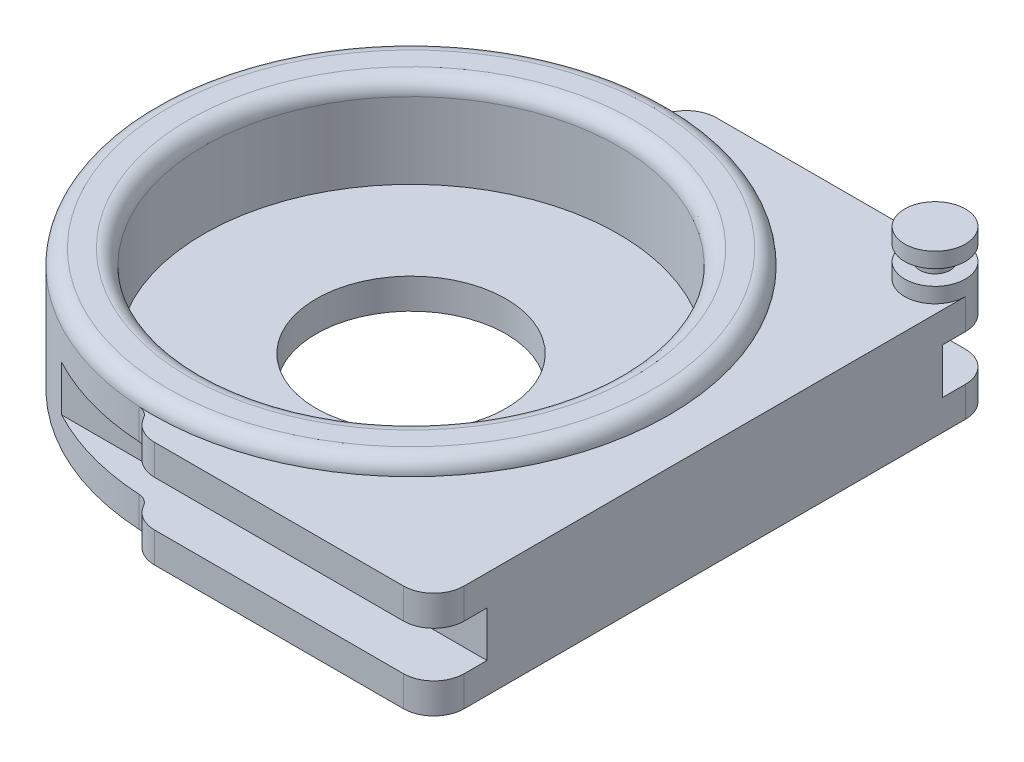
ISO-10303-21;
HEADER;
FILE_DESCRIPTION(('STEP AP214'),'2;1');
FILE_NAME('part.step','',(''),(''),'','','');
FILE_SCHEMA(('AUTOMOTIVE_DESIGN { 1 0 10303 214 1 1 1 1 }'));
ENDSEC;
DATA;
#1=APPLICATION_CONTEXT('core data for automotive mechanical design processes');
#2=APPLICATION_PROTOCOL_DEFINITION('international standard','automotive_design',2000,#1);
#3=PRODUCT_CONTEXT('',#1,'mechanical');
#4=PRODUCT('Part','Part','',(#3));
#5=PRODUCT_RELATED_PRODUCT_CATEGORY('part','',(#4));
#6=PRODUCT_DEFINITION_FORMATION('','',#4);
#7=PRODUCT_DEFINITION_CONTEXT('part definition',#1,'design');
#8=PRODUCT_DEFINITION('design','',#6,#7);
#9=PRODUCT_DEFINITION_SHAPE('','',#8);
#10=(LENGTH_UNIT() NAMED_UNIT(*) SI_UNIT(.MILLI.,.METRE.));
#11=(NAMED_UNIT(*) PLANE_ANGLE_UNIT() SI_UNIT($,.RADIAN.));
#12=(NAMED_UNIT(*) SI_UNIT($,.STERADIAN.) SOLID_ANGLE_UNIT());
#13=UNCERTAINTY_MEASURE_WITH_UNIT(LENGTH_MEASURE(1.E-05),#10,'distance_accuracy_value','');
#14=(GEOMETRIC_REPRESENTATION_CONTEXT(3) GLOBAL_UNCERTAINTY_ASSIGNED_CONTEXT((#13)) GLOBAL_UNIT_ASSIGNED_CONTEXT((#10,
#11,#12)) REPRESENTATION_CONTEXT('',''));
#15=CARTESIAN_POINT('',(0.,0.,0.));
#16=DIRECTION('',(0.,0.,1.));
#17=DIRECTION('',(1.,0.,0.));
#18=AXIS2_PLACEMENT_3D('',#15,#16,#17);
#19=CARTESIAN_POINT('',(-23.6838749144705,8.,0.));
#20=DIRECTION('',(0.,1.,0.));
#21=DIRECTION('',(0.,0.,1.));
#22=AXIS2_PLACEMENT_3D('',#19,#20,#21);
#23=PLANE('',#22);
#24=CARTESIAN_POINT('',(18.,8.,-16.5));
#25=DIRECTION('',(0.,1.,0.));
#26=DIRECTION('',(0.,0.,1.));
#27=AXIS2_PLACEMENT_3D('',#24,#25,#26);
#28=CIRCLE('',#27,2.);
#29=CARTESIAN_POINT('',(18.,8.,-14.5));
#30=VERTEX_POINT('',#29);
#31=EDGE_CURVE('E268',#30,#30,#28,.T.);
#32=ORIENTED_EDGE('',*,*,#31,.T.);
#33=EDGE_LOOP('',(#32));
#34=FACE_BOUND('',#33,.T.);
#35=CARTESIAN_POINT('',(18.,8.,-16.5));
#36=DIRECTION('',(0.,1.,0.));
#37=DIRECTION('',(0.,0.,1.));
#38=AXIS2_PLACEMENT_3D('',#35,#36,#37);
#39=CIRCLE('',#38,1.);
#40=CARTESIAN_POINT('',(18.,8.,-15.5));
#41=VERTEX_POINT('',#40);
#42=EDGE_CURVE('E258',#41,#41,#39,.T.);
#43=ORIENTED_EDGE('',*,*,#42,.F.);
#44=EDGE_LOOP('',(#43));
#45=FACE_BOUND('',#44,.T.);
#46=ADVANCED_FACE('F31',(#34,#45),#23,.T.);
#47=CARTESIAN_POINT('',(-39.3414213562373,7.,0.));
#48=DIRECTION('',(0.,1.,0.));
#49=DIRECTION('',(0.,0.,1.));
#50=AXIS2_PLACEMENT_3D('',#47,#48,#49);
#51=PLANE('',#50);
#52=DIRECTION('',(0.,0.,-1.));
#53=VECTOR('',#52,1.);
#54=CARTESIAN_POINT('',(20.,7.,0.));
#55=LINE('',#54,#53);
#56=CARTESIAN_POINT('',(20.,7.,16.5));
#57=VERTEX_POINT('',#56);
#58=CARTESIAN_POINT('',(20.,7.,-16.5));
#59=VERTEX_POINT('',#58);
#60=EDGE_CURVE('E554',#57,#59,#55,.T.);
#61=ORIENTED_EDGE('',*,*,#60,.T.);
#62=CARTESIAN_POINT('',(18.,7.,-16.5));
#63=DIRECTION('',(0.,1.,0.));
#64=DIRECTION('',(0.,0.,1.));
#65=AXIS2_PLACEMENT_3D('',#62,#63,#64);
#66=CIRCLE('',#65,2.);
#67=CARTESIAN_POINT('',(18.,7.,-18.5));
#68=VERTEX_POINT('',#67);
#69=EDGE_CURVE('E265',#68,#59,#66,.T.);
#70=ORIENTED_EDGE('',*,*,#69,.F.);
#71=DIRECTION('',(-1.,0.,0.));
#72=VECTOR('',#71,1.);
#73=CARTESIAN_POINT('',(-39.3414213562373,7.,-18.5));
#74=LINE('',#73,#72);
#75=CARTESIAN_POINT('',(1.61392902259743,7.,-18.5));
#76=VERTEX_POINT('',#75);
#77=EDGE_CURVE('E310',#68,#76,#74,.T.);
#78=ORIENTED_EDGE('',*,*,#77,.T.);
#79=CARTESIAN_POINT('',(1.61392902259743,7.,-16.5));
#80=DIRECTION('',(0.,1.,0.));
#81=DIRECTION('',(0.,0.,1.));
#82=AXIS2_PLACEMENT_3D('',#79,#80,#81);
#83=CIRCLE('',#82,2.);
#84=CARTESIAN_POINT('',(-0.128690325800858,7.,-17.4814671704076));
#85=VERTEX_POINT('',#84);
#86=EDGE_CURVE('E338',#76,#85,#83,.T.);
#87=ORIENTED_EDGE('',*,*,#86,.T.);
#88=CARTESIAN_POINT('',(-1.,7.,-17.9722007556114));
#89=DIRECTION('',(0.,1.,0.));
#90=DIRECTION('',(0.,0.,1.));
#91=AXIS2_PLACEMENT_3D('',#88,#89,#90);
#92=CIRCLE('',#91,1.);
#93=CARTESIAN_POINT('',(-0.944444444444445,7.,-16.9737451580775));
#94=VERTEX_POINT('',#93);
#95=EDGE_CURVE('E513',#85,#94,#92,.F.);
#96=ORIENTED_EDGE('',*,*,#95,.T.);
#97=CARTESIAN_POINT('',(0.,7.,0.));
#98=DIRECTION('',(0.,1.,0.));
#99=DIRECTION('',(0.,0.,1.));
#100=AXIS2_PLACEMENT_3D('',#97,#98,#99);
#101=CIRCLE('',#100,17.);
#102=CARTESIAN_POINT('',(-0.944444444444445,7.,16.9737451580775));
#103=VERTEX_POINT('',#102);
#104=EDGE_CURVE('E271',#103,#94,#101,.T.);
#105=ORIENTED_EDGE('',*,*,#104,.F.);
#106=CARTESIAN_POINT('',(-1.,7.,17.9722007556114));
#107=DIRECTION('',(0.,1.,0.));
#108=DIRECTION('',(0.,0.,1.));
#109=AXIS2_PLACEMENT_3D('',#106,#107,#108);
#110=CIRCLE('',#109,1.);
#111=CARTESIAN_POINT('',(-0.128690325800858,7.,17.4814671704076));
#112=VERTEX_POINT('',#111);
#113=EDGE_CURVE('E528',#103,#112,#110,.F.);
#114=ORIENTED_EDGE('',*,*,#113,.T.);
#115=CARTESIAN_POINT('',(1.61392902259743,7.,16.5));
#116=DIRECTION('',(0.,1.,0.));
#117=DIRECTION('',(0.,0.,1.));
#118=AXIS2_PLACEMENT_3D('',#115,#116,#117);
#119=CIRCLE('',#118,2.);
#120=CARTESIAN_POINT('',(1.61392902259743,7.,18.5));
#121=VERTEX_POINT('',#120);
#122=EDGE_CURVE('E342',#112,#121,#119,.T.);
#123=ORIENTED_EDGE('',*,*,#122,.T.);
#124=DIRECTION('',(1.,0.,0.));
#125=VECTOR('',#124,1.);
#126=CARTESIAN_POINT('',(-39.3414213562373,7.,18.5));
#127=LINE('',#126,#125);
#128=CARTESIAN_POINT('',(18.,7.,18.5));
#129=VERTEX_POINT('',#128);
#130=EDGE_CURVE('E543',#121,#129,#127,.T.);
#131=ORIENTED_EDGE('',*,*,#130,.T.);
#132=CARTESIAN_POINT('',(18.,7.,16.5));
#133=DIRECTION('',(0.,1.,0.));
#134=DIRECTION('',(0.,0.,1.));
#135=AXIS2_PLACEMENT_3D('',#132,#133,#134);
#136=CIRCLE('',#135,2.);
#137=EDGE_CURVE('E340',#129,#57,#136,.T.);
#138=ORIENTED_EDGE('',*,*,#137,.T.);
#139=EDGE_LOOP('',(#61,#70,#78,#87,#96,#105,#114,#123,#131,#138));
#140=FACE_BOUND('',#139,.T.);
#141=ADVANCED_FACE('F570',(#140),#51,.T.);
#142=CARTESIAN_POINT('',(0.,2.,0.));
#143=DIRECTION('',(0.,-1.,0.));
#144=DIRECTION('',(0.,0.,-1.));
#145=AXIS2_PLACEMENT_3D('',#142,#143,#144);
#146=CYLINDRICAL_SURFACE('',#145,6.25);
#147=CARTESIAN_POINT('',(0.,0.,0.));
#148=DIRECTION('',(0.,1.,0.));
#149=DIRECTION('',(0.,0.,1.));
#150=AXIS2_PLACEMENT_3D('',#147,#148,#149);
#151=CIRCLE('',#150,6.25);
#152=CARTESIAN_POINT('',(0.,0.,6.25));
#153=VERTEX_POINT('',#152);
#154=EDGE_CURVE('E449',#153,#153,#151,.T.);
#155=ORIENTED_EDGE('',*,*,#154,.F.);
#156=EDGE_LOOP('',(#155));
#157=FACE_BOUND('',#156,.T.);
#158=CARTESIAN_POINT('',(0.,2.,0.));
#159=DIRECTION('',(0.,1.,0.));
#160=DIRECTION('',(0.,0.,1.));
#161=AXIS2_PLACEMENT_3D('',#158,#159,#160);
#162=CIRCLE('',#161,6.25);
#163=CARTESIAN_POINT('',(0.,2.,6.25));
#164=VERTEX_POINT('',#163);
#165=EDGE_CURVE('E277',#164,#164,#162,.T.);
#166=ORIENTED_EDGE('',*,*,#165,.T.);
#167=EDGE_LOOP('',(#166));
#168=FACE_BOUND('',#167,.T.);
#169=ADVANCED_FACE('F578',(#157,#168),#146,.F.);
#170=CARTESIAN_POINT('',(-39.3414213562373,2.,0.));
#171=DIRECTION('',(0.,1.,0.));
#172=DIRECTION('',(0.,0.,1.));
#173=AXIS2_PLACEMENT_3D('',#170,#171,#172);
#174=PLANE('',#173);
#175=CARTESIAN_POINT('',(-0.999999999999993,2.,17.9722007556114));
#176=DIRECTION('',(0.,1.,0.));
#177=DIRECTION('',(0.,0.,1.));
#178=AXIS2_PLACEMENT_3D('',#175,#176,#177);
#179=CIRCLE('',#178,1.);
#180=CARTESIAN_POINT('',(-0.944444444444438,2.,16.9737451580775));
#181=VERTEX_POINT('',#180);
#182=CARTESIAN_POINT('',(-0.128690325800851,2.,17.4814671704076));
#183=VERTEX_POINT('',#182);
#184=EDGE_CURVE('E533',#181,#183,#179,.F.);
#185=ORIENTED_EDGE('',*,*,#184,.T.);
#186=CARTESIAN_POINT('',(1.61392902259743,2.,16.5));
#187=DIRECTION('',(0.,1.,0.));
#188=DIRECTION('',(0.,0.,1.));
#189=AXIS2_PLACEMENT_3D('',#186,#187,#188);
#190=CIRCLE('',#189,2.);
#191=CARTESIAN_POINT('',(1.61392902259743,2.,18.5));
#192=VERTEX_POINT('',#191);
#193=EDGE_CURVE('E361',#183,#192,#190,.T.);
#194=ORIENTED_EDGE('',*,*,#193,.T.);
#195=DIRECTION('',(-1.,0.,0.));
#196=VECTOR('',#195,1.);
#197=CARTESIAN_POINT('',(-39.3414213562373,2.,18.5));
#198=LINE('',#197,#196);
#199=CARTESIAN_POINT('',(18.,2.,18.5));
#200=VERTEX_POINT('',#199);
#201=EDGE_CURVE('E372',#200,#192,#198,.T.);
#202=ORIENTED_EDGE('',*,*,#201,.F.);
#203=CARTESIAN_POINT('',(18.,2.,16.5));
#204=DIRECTION('',(0.,1.,0.));
#205=DIRECTION('',(0.,0.,1.));
#206=AXIS2_PLACEMENT_3D('',#203,#204,#205);
#207=CIRCLE('',#206,2.);
#208=CARTESIAN_POINT('',(20.,2.,16.5));
#209=VERTEX_POINT('',#208);
#210=EDGE_CURVE('E359',#200,#209,#207,.T.);
#211=ORIENTED_EDGE('',*,*,#210,.T.);
#212=DIRECTION('',(0.,0.,1.));
#213=VECTOR('',#212,1.);
#214=CARTESIAN_POINT('',(20.,2.,0.));
#215=LINE('',#214,#213);
#216=CARTESIAN_POINT('',(20.,2.,15.));
#217=VERTEX_POINT('',#216);
#218=EDGE_CURVE('E367',#217,#209,#215,.T.);
#219=ORIENTED_EDGE('',*,*,#218,.F.);
#220=DIRECTION('',(1.,0.,0.));
#221=VECTOR('',#220,1.);
#222=CARTESIAN_POINT('',(-39.3414213562373,2.,15.));
#223=LINE('',#222,#221);
#224=CARTESIAN_POINT('',(-8.,2.,15.));
#225=VERTEX_POINT('',#224);
#226=EDGE_CURVE('E385',#225,#217,#223,.T.);
#227=ORIENTED_EDGE('',*,*,#226,.F.);
#228=CARTESIAN_POINT('',(0.,2.,0.));
#229=DIRECTION('',(0.,1.,0.));
#230=DIRECTION('',(0.,0.,1.));
#231=AXIS2_PLACEMENT_3D('',#228,#229,#230);
#232=CIRCLE('',#231,17.);
#233=EDGE_CURVE('E379',#225,#181,#232,.T.);
#234=ORIENTED_EDGE('',*,*,#233,.T.);
#235=EDGE_LOOP('',(#185,#194,#202,#211,#219,#227,#234));
#236=FACE_BOUND('',#235,.T.);
#237=ADVANCED_FACE('F480',(#236),#174,.T.);
#238=CARTESIAN_POINT('',(0.,2.,0.));
#239=DIRECTION('',(0.,-1.,0.));
#240=DIRECTION('',(0.,0.,-1.));
#241=AXIS2_PLACEMENT_3D('',#238,#239,#240);
#242=CYLINDRICAL_SURFACE('',#241,17.);
#243=CARTESIAN_POINT('',(-0.944444444444438,2.,-16.9737451580775));
#244=VERTEX_POINT('',#243);
#245=CARTESIAN_POINT('',(-8.,2.,-15.));
#246=VERTEX_POINT('',#245);
#247=EDGE_CURVE('E304',#244,#246,#232,.T.);
#248=ORIENTED_EDGE('',*,*,#247,.F.);
#249=DIRECTION('',(0.,-1.,0.));
#250=VECTOR('',#249,1.);
#251=CARTESIAN_POINT('',(-0.944444444444438,2.,-16.9737451580775));
#252=LINE('',#251,#250);
#253=CARTESIAN_POINT('',(-0.944444444444438,0.,-16.9737451580775));
#254=VERTEX_POINT('',#253);
#255=EDGE_CURVE('E713',#244,#254,#252,.T.);
#256=ORIENTED_EDGE('',*,*,#255,.T.);
#257=CARTESIAN_POINT('',(0.,0.,0.));
#258=DIRECTION('',(0.,1.,0.));
#259=DIRECTION('',(0.,0.,1.));
#260=AXIS2_PLACEMENT_3D('',#257,#258,#259);
#261=CIRCLE('',#260,17.);
#262=CARTESIAN_POINT('',(-0.944444444444438,0.,16.9737451580775));
#263=VERTEX_POINT('',#262);
#264=EDGE_CURVE('E423',#254,#263,#261,.T.);
#265=ORIENTED_EDGE('',*,*,#264,.T.);
#266=DIRECTION('',(0.,-1.,0.));
#267=VECTOR('',#266,1.);
#268=CARTESIAN_POINT('',(-0.944444444444438,2.,16.9737451580775));
#269=LINE('',#268,#267);
#270=EDGE_CURVE('E716',#263,#181,#269,.F.);
#271=ORIENTED_EDGE('',*,*,#270,.T.);
#272=ORIENTED_EDGE('',*,*,#233,.F.);
#273=DIRECTION('',(0.,-1.,0.));
#274=VECTOR('',#273,1.);
#275=CARTESIAN_POINT('',(-8.,5.,15.));
#276=LINE('',#275,#274);
#277=CARTESIAN_POINT('',(-8.,5.,15.));
#278=VERTEX_POINT('',#277);
#279=EDGE_CURVE('E400',#278,#225,#276,.T.);
#280=ORIENTED_EDGE('',*,*,#279,.F.);
#281=CARTESIAN_POINT('',(0.,5.,0.));
#282=DIRECTION('',(0.,1.,0.));
#283=DIRECTION('',(0.,0.,1.));
#284=AXIS2_PLACEMENT_3D('',#281,#282,#283);
#285=CIRCLE('',#284,17.);
#286=CARTESIAN_POINT('',(-0.944444444444445,5.,16.9737451580775));
#287=VERTEX_POINT('',#286);
#288=EDGE_CURVE('E303',#278,#287,#285,.T.);
#289=ORIENTED_EDGE('',*,*,#288,.T.);
#290=DIRECTION('',(0.,-1.,0.));
#291=VECTOR('',#290,1.);
#292=CARTESIAN_POINT('',(-0.944444444444445,2.,16.9737451580775));
#293=LINE('',#292,#291);
#294=EDGE_CURVE('E712',#287,#103,#293,.F.);
#295=ORIENTED_EDGE('',*,*,#294,.T.);
#296=CARTESIAN_POINT('',(0.,7.,0.));
#297=DIRECTION('',(0.,1.,0.));
#298=DIRECTION('',(0.,0.,1.));
#299=AXIS2_PLACEMENT_3D('',#296,#297,#298);
#300=CIRCLE('',#299,17.);
#301=EDGE_CURVE('E292',#103,#94,#300,.F.);
#302=ORIENTED_EDGE('',*,*,#301,.T.);
#303=DIRECTION('',(0.,-1.,0.));
#304=VECTOR('',#303,1.);
#305=CARTESIAN_POINT('',(-0.944444444444445,2.,-16.9737451580775));
#306=LINE('',#305,#304);
#307=CARTESIAN_POINT('',(-0.944444444444445,5.,-16.9737451580775));
#308=VERTEX_POINT('',#307);
#309=EDGE_CURVE('E710',#94,#308,#306,.T.);
#310=ORIENTED_EDGE('',*,*,#309,.T.);
#311=CARTESIAN_POINT('',(-8.,5.,-15.));
#312=VERTEX_POINT('',#311);
#313=EDGE_CURVE('E299',#308,#312,#285,.T.);
#314=ORIENTED_EDGE('',*,*,#313,.T.);
#315=DIRECTION('',(0.,-1.,0.));
#316=VECTOR('',#315,1.);
#317=CARTESIAN_POINT('',(-8.,5.,-15.));
#318=LINE('',#317,#316);
#319=EDGE_CURVE('E386',#312,#246,#318,.T.);
#320=ORIENTED_EDGE('',*,*,#319,.T.);
#321=EDGE_LOOP('',(#248,#256,#265,#271,#272,#280,#289,#295,#302,#310,#314,#320));
#322=FACE_BOUND('',#321,.T.);
#323=ADVANCED_FACE('F437',(#322),#242,.T.);
#324=CARTESIAN_POINT('',(-39.3414213562373,2.,18.5));
#325=DIRECTION('',(0.,0.,1.));
#326=DIRECTION('',(1.,0.,0.));
#327=AXIS2_PLACEMENT_3D('',#324,#325,#326);
#328=PLANE('',#327);
#329=ORIENTED_EDGE('',*,*,#201,.T.);
#330=DIRECTION('',(0.,1.,0.));
#331=VECTOR('',#330,1.);
#332=CARTESIAN_POINT('',(1.61392902259743,0.,18.5));
#333=LINE('',#332,#331);
#334=CARTESIAN_POINT('',(1.61392902259743,0.,18.5));
#335=VERTEX_POINT('',#334);
#336=EDGE_CURVE('E346',#192,#335,#333,.F.);
#337=ORIENTED_EDGE('',*,*,#336,.T.);
#338=DIRECTION('',(-1.,0.,0.));
#339=VECTOR('',#338,1.);
#340=CARTESIAN_POINT('',(-39.3414213562373,0.,18.5));
#341=LINE('',#340,#339);
#342=CARTESIAN_POINT('',(18.,0.,18.5));
#343=VERTEX_POINT('',#342);
#344=EDGE_CURVE('E426',#343,#335,#341,.T.);
#345=ORIENTED_EDGE('',*,*,#344,.F.);
#346=DIRECTION('',(0.,-1.,0.));
#347=VECTOR('',#346,1.);
#348=CARTESIAN_POINT('',(18.,2.,18.5));
#349=LINE('',#348,#347);
#350=EDGE_CURVE('E344',#343,#200,#349,.F.);
#351=ORIENTED_EDGE('',*,*,#350,.T.);
#352=EDGE_LOOP('',(#329,#337,#345,#351));
#353=FACE_BOUND('',#352,.T.);
#354=ADVANCED_FACE('F471',(#353),#328,.T.);
#355=CARTESIAN_POINT('',(20.,2.,0.));
#356=DIRECTION('',(1.,0.,0.));
#357=DIRECTION('',(0.,0.,-1.));
#358=AXIS2_PLACEMENT_3D('',#355,#356,#357);
#359=PLANE('',#358);
#360=ORIENTED_EDGE('',*,*,#218,.T.);
#361=DIRECTION('',(0.,-1.,0.));
#362=VECTOR('',#361,1.);
#363=CARTESIAN_POINT('',(20.,2.,16.5));
#364=LINE('',#363,#362);
#365=CARTESIAN_POINT('',(20.,0.,16.5));
#366=VERTEX_POINT('',#365);
#367=EDGE_CURVE('E479',#209,#366,#364,.T.);
#368=ORIENTED_EDGE('',*,*,#367,.T.);
#369=DIRECTION('',(0.,0.,1.));
#370=VECTOR('',#369,1.);
#371=CARTESIAN_POINT('',(20.,0.,0.));
#372=LINE('',#371,#370);
#373=CARTESIAN_POINT('',(20.,0.,-16.5));
#374=VERTEX_POINT('',#373);
#375=EDGE_CURVE('E459',#374,#366,#372,.T.);
#376=ORIENTED_EDGE('',*,*,#375,.F.);
#377=DIRECTION('',(0.,-1.,0.));
#378=VECTOR('',#377,1.);
#379=CARTESIAN_POINT('',(20.,2.,-16.5));
#380=LINE('',#379,#378);
#381=CARTESIAN_POINT('',(20.,2.,-16.5));
#382=VERTEX_POINT('',#381);
#383=EDGE_CURVE('E363',#374,#382,#380,.F.);
#384=ORIENTED_EDGE('',*,*,#383,.T.);
#385=CARTESIAN_POINT('',(20.,2.,-15.));
#386=VERTEX_POINT('',#385);
#387=EDGE_CURVE('E364',#382,#386,#215,.T.);
#388=ORIENTED_EDGE('',*,*,#387,.T.);
#389=DIRECTION('',(0.,-1.,0.));
#390=VECTOR('',#389,1.);
#391=CARTESIAN_POINT('',(20.,5.,-15.));
#392=LINE('',#391,#390);
#393=CARTESIAN_POINT('',(20.,5.,-15.));
#394=VERTEX_POINT('',#393);
#395=EDGE_CURVE('E424',#394,#386,#392,.T.);
#396=ORIENTED_EDGE('',*,*,#395,.F.);
#397=DIRECTION('',(0.,0.,-1.));
#398=VECTOR('',#397,1.);
#399=CARTESIAN_POINT('',(20.,5.,0.));
#400=LINE('',#399,#398);
#401=CARTESIAN_POINT('',(20.,5.,-16.5));
#402=VERTEX_POINT('',#401);
#403=EDGE_CURVE('E320',#394,#402,#400,.T.);
#404=ORIENTED_EDGE('',*,*,#403,.T.);
#405=DIRECTION('',(0.,-1.,0.));
#406=VECTOR('',#405,1.);
#407=CARTESIAN_POINT('',(20.,7.,-16.5));
#408=LINE('',#407,#406);
#409=EDGE_CURVE('E555',#402,#59,#408,.F.);
#410=ORIENTED_EDGE('',*,*,#409,.T.);
#411=ORIENTED_EDGE('',*,*,#60,.F.);
#412=DIRECTION('',(0.,-1.,0.));
#413=VECTOR('',#412,1.);
#414=CARTESIAN_POINT('',(20.,5.,16.5));
#415=LINE('',#414,#413);
#416=CARTESIAN_POINT('',(20.,5.,16.5));
#417=VERTEX_POINT('',#416);
#418=EDGE_CURVE('E485',#57,#417,#415,.T.);
#419=ORIENTED_EDGE('',*,*,#418,.T.);
#420=CARTESIAN_POINT('',(20.,5.,15.));
#421=VERTEX_POINT('',#420);
#422=EDGE_CURVE('E322',#417,#421,#400,.T.);
#423=ORIENTED_EDGE('',*,*,#422,.T.);
#424=DIRECTION('',(0.,-1.,0.));
#425=VECTOR('',#424,1.);
#426=CARTESIAN_POINT('',(20.,5.,15.));
#427=LINE('',#426,#425);
#428=EDGE_CURVE('E421',#421,#217,#427,.T.);
#429=ORIENTED_EDGE('',*,*,#428,.T.);
#430=EDGE_LOOP('',(#360,#368,#376,#384,#388,#396,#404,#410,#411,#419,#423,#429));
#431=FACE_BOUND('',#430,.T.);
#432=ADVANCED_FACE('F481',(#431),#359,.T.);
#433=CARTESIAN_POINT('',(-39.3414213562373,2.,-18.5));
#434=DIRECTION('',(0.,0.,1.));
#435=DIRECTION('',(1.,0.,0.));
#436=AXIS2_PLACEMENT_3D('',#433,#434,#435);
#437=PLANE('',#436);
#438=DIRECTION('',(-1.,0.,0.));
#439=VECTOR('',#438,1.);
#440=CARTESIAN_POINT('',(-39.3414213562373,2.,-18.5));
#441=LINE('',#440,#439);
#442=CARTESIAN_POINT('',(18.,2.,-18.5));
#443=VERTEX_POINT('',#442);
#444=CARTESIAN_POINT('',(1.61392902259743,2.,-18.5));
#445=VERTEX_POINT('',#444);
#446=EDGE_CURVE('E289',#443,#445,#441,.T.);
#447=ORIENTED_EDGE('',*,*,#446,.F.);
#448=DIRECTION('',(0.,-1.,0.));
#449=VECTOR('',#448,1.);
#450=CARTESIAN_POINT('',(18.,0.,-18.5));
#451=LINE('',#450,#449);
#452=CARTESIAN_POINT('',(18.,0.,-18.5));
#453=VERTEX_POINT('',#452);
#454=EDGE_CURVE('E492',#443,#453,#451,.T.);
#455=ORIENTED_EDGE('',*,*,#454,.T.);
#456=DIRECTION('',(-1.,0.,0.));
#457=VECTOR('',#456,1.);
#458=CARTESIAN_POINT('',(-39.3414213562373,0.,-18.5));
#459=LINE('',#458,#457);
#460=CARTESIAN_POINT('',(1.61392902259743,0.,-18.5));
#461=VERTEX_POINT('',#460);
#462=EDGE_CURVE('E455',#453,#461,#459,.T.);
#463=ORIENTED_EDGE('',*,*,#462,.T.);
#464=DIRECTION('',(0.,-1.,0.));
#465=VECTOR('',#464,1.);
#466=CARTESIAN_POINT('',(1.61392902259743,2.,-18.5));
#467=LINE('',#466,#465);
#468=EDGE_CURVE('E497',#461,#445,#467,.F.);
#469=ORIENTED_EDGE('',*,*,#468,.T.);
#470=EDGE_LOOP('',(#447,#455,#463,#469));
#471=FACE_BOUND('',#470,.T.);
#472=ADVANCED_FACE('F495',(#471),#437,.F.);
#473=ORIENTED_EDGE('',*,*,#387,.F.);
#474=CARTESIAN_POINT('',(18.,2.,-16.5));
#475=DIRECTION('',(0.,1.,0.));
#476=DIRECTION('',(0.,0.,1.));
#477=AXIS2_PLACEMENT_3D('',#474,#475,#476);
#478=CIRCLE('',#477,2.);
#479=EDGE_CURVE('E499',#382,#443,#478,.T.);
#480=ORIENTED_EDGE('',*,*,#479,.T.);
#481=ORIENTED_EDGE('',*,*,#446,.T.);
#482=CARTESIAN_POINT('',(1.61392902259743,2.,-16.5));
#483=DIRECTION('',(0.,1.,0.));
#484=DIRECTION('',(0.,0.,1.));
#485=AXIS2_PLACEMENT_3D('',#482,#483,#484);
#486=CIRCLE('',#485,2.);
#487=CARTESIAN_POINT('',(-0.128690325800851,2.,-17.4814671704076));
#488=VERTEX_POINT('',#487);
#489=EDGE_CURVE('E54',#445,#488,#486,.T.);
#490=ORIENTED_EDGE('',*,*,#489,.T.);
#491=CARTESIAN_POINT('',(-0.999999999999993,2.,-17.9722007556114));
#492=DIRECTION('',(0.,1.,0.));
#493=DIRECTION('',(0.,0.,1.));
#494=AXIS2_PLACEMENT_3D('',#491,#492,#493);
#495=CIRCLE('',#494,1.);
#496=EDGE_CURVE('E446',#488,#244,#495,.F.);
#497=ORIENTED_EDGE('',*,*,#496,.T.);
#498=ORIENTED_EDGE('',*,*,#247,.T.);
#499=DIRECTION('',(-1.,0.,0.));
#500=VECTOR('',#499,1.);
#501=CARTESIAN_POINT('',(-39.3414213562373,2.,-15.));
#502=LINE('',#501,#500);
#503=EDGE_CURVE('E381',#386,#246,#502,.T.);
#504=ORIENTED_EDGE('',*,*,#503,.F.);
#505=EDGE_LOOP('',(#473,#480,#481,#490,#497,#498,#504));
#506=FACE_BOUND('',#505,.T.);
#507=ADVANCED_FACE('F444',(#506),#174,.T.);
#508=CARTESIAN_POINT('',(-39.3414213562373,0.,0.));
#509=DIRECTION('',(0.,1.,0.));
#510=DIRECTION('',(0.,0.,1.));
#511=AXIS2_PLACEMENT_3D('',#508,#509,#510);
#512=PLANE('',#511);
#513=DIRECTION('',(0.,0.,1.));
#514=VECTOR('',#513,1.);
#515=CARTESIAN_POINT('',(19.,0.,-40.8414213562373));
#516=LINE('',#515,#514);
#517=CARTESIAN_POINT('',(19.,0.,-14.));
#518=VERTEX_POINT('',#517);
#519=CARTESIAN_POINT('',(19.,0.,14.));
#520=VERTEX_POINT('',#519);
#521=EDGE_CURVE('E241',#518,#520,#516,.T.);
#522=ORIENTED_EDGE('',*,*,#521,.F.);
#523=DIRECTION('',(1.,0.,0.));
#524=VECTOR('',#523,1.);
#525=CARTESIAN_POINT('',(1.5,0.,-14.));
#526=LINE('',#525,#524);
#527=CARTESIAN_POINT('',(9.64365076099295,0.,-14.));
#528=VERTEX_POINT('',#527);
#529=EDGE_CURVE('E234',#528,#518,#526,.T.);
#530=ORIENTED_EDGE('',*,*,#529,.F.);
#531=CARTESIAN_POINT('',(0.,0.,0.));
#532=DIRECTION('',(0.,-1.,0.));
#533=DIRECTION('',(0.,0.,-1.));
#534=AXIS2_PLACEMENT_3D('',#531,#532,#533);
#535=CIRCLE('',#534,17.);
#536=CARTESIAN_POINT('',(9.64365076099297,0.,14.));
#537=VERTEX_POINT('',#536);
#538=EDGE_CURVE('E245',#528,#537,#535,.T.);
#539=ORIENTED_EDGE('',*,*,#538,.T.);
#540=DIRECTION('',(-1.,0.,0.));
#541=VECTOR('',#540,1.);
#542=CARTESIAN_POINT('',(1.5,0.,14.));
#543=LINE('',#542,#541);
#544=EDGE_CURVE('E46',#520,#537,#543,.T.);
#545=ORIENTED_EDGE('',*,*,#544,.F.);
#546=EDGE_LOOP('',(#522,#530,#539,#545));
#547=FACE_BOUND('',#546,.T.);
#548=ORIENTED_EDGE('',*,*,#344,.T.);
#549=CARTESIAN_POINT('',(1.61392902259743,0.,16.5));
#550=DIRECTION('',(0.,1.,0.));
#551=DIRECTION('',(0.,0.,1.));
#552=AXIS2_PLACEMENT_3D('',#549,#550,#551);
#553=CIRCLE('',#552,2.);
#554=CARTESIAN_POINT('',(-0.128690325800851,0.,17.4814671704076));
#555=VERTEX_POINT('',#554);
#556=EDGE_CURVE('E355',#335,#555,#553,.F.);
#557=ORIENTED_EDGE('',*,*,#556,.T.);
#558=CARTESIAN_POINT('',(-0.999999999999993,0.,17.9722007556114));
#559=DIRECTION('',(0.,1.,0.));
#560=DIRECTION('',(0.,0.,1.));
#561=AXIS2_PLACEMENT_3D('',#558,#559,#560);
#562=CIRCLE('',#561,1.);
#563=EDGE_CURVE('E531',#555,#263,#562,.T.);
#564=ORIENTED_EDGE('',*,*,#563,.T.);
#565=ORIENTED_EDGE('',*,*,#264,.F.);
#566=CARTESIAN_POINT('',(-0.999999999999993,0.,-17.9722007556114));
#567=DIRECTION('',(0.,1.,0.));
#568=DIRECTION('',(0.,0.,1.));
#569=AXIS2_PLACEMENT_3D('',#566,#567,#568);
#570=CIRCLE('',#569,1.);
#571=CARTESIAN_POINT('',(-0.128690325800851,0.,-17.4814671704076));
#572=VERTEX_POINT('',#571);
#573=EDGE_CURVE('E523',#254,#572,#570,.T.);
#574=ORIENTED_EDGE('',*,*,#573,.T.);
#575=CARTESIAN_POINT('',(1.61392902259743,0.,-16.5));
#576=DIRECTION('',(0.,1.,0.));
#577=DIRECTION('',(0.,0.,1.));
#578=AXIS2_PLACEMENT_3D('',#575,#576,#577);
#579=CIRCLE('',#578,2.);
#580=EDGE_CURVE('E349',#572,#461,#579,.F.);
#581=ORIENTED_EDGE('',*,*,#580,.T.);
#582=ORIENTED_EDGE('',*,*,#462,.F.);
#583=CARTESIAN_POINT('',(18.,0.,-16.5));
#584=DIRECTION('',(0.,1.,0.));
#585=DIRECTION('',(0.,0.,1.));
#586=AXIS2_PLACEMENT_3D('',#583,#584,#585);
#587=CIRCLE('',#586,2.);
#588=EDGE_CURVE('E351',#453,#374,#587,.F.);
#589=ORIENTED_EDGE('',*,*,#588,.T.);
#590=ORIENTED_EDGE('',*,*,#375,.T.);
#591=CARTESIAN_POINT('',(18.,0.,16.5));
#592=DIRECTION('',(0.,1.,0.));
#593=DIRECTION('',(0.,0.,1.));
#594=AXIS2_PLACEMENT_3D('',#591,#592,#593);
#595=CIRCLE('',#594,2.);
#596=EDGE_CURVE('E353',#366,#343,#595,.F.);
#597=ORIENTED_EDGE('',*,*,#596,.T.);
#598=EDGE_LOOP('',(#548,#557,#564,#565,#574,#581,#582,#589,#590,#597));
#599=FACE_BOUND('',#598,.T.);
#600=ORIENTED_EDGE('',*,*,#154,.T.);
#601=EDGE_LOOP('',(#600));
#602=FACE_BOUND('',#601,.T.);
#603=ADVANCED_FACE('F467',(#547,#599,#602),#512,.F.);
#604=CARTESIAN_POINT('',(-39.3414213562373,5.,15.));
#605=DIRECTION('',(0.,0.,-1.));
#606=DIRECTION('',(-1.,0.,0.));
#607=AXIS2_PLACEMENT_3D('',#604,#605,#606);
#608=PLANE('',#607);
#609=ORIENTED_EDGE('',*,*,#226,.T.);
#610=ORIENTED_EDGE('',*,*,#428,.F.);
#611=DIRECTION('',(1.,0.,0.));
#612=VECTOR('',#611,1.);
#613=CARTESIAN_POINT('',(-39.3414213562373,5.,15.));
#614=LINE('',#613,#612);
#615=EDGE_CURVE('E282',#278,#421,#614,.T.);
#616=ORIENTED_EDGE('',*,*,#615,.F.);
#617=ORIENTED_EDGE('',*,*,#279,.T.);
#618=EDGE_LOOP('',(#609,#610,#616,#617));
#619=FACE_BOUND('',#618,.T.);
#620=ADVANCED_FACE('F419',(#619),#608,.F.);
#621=CARTESIAN_POINT('',(-39.3414213562373,5.,-15.));
#622=DIRECTION('',(0.,0.,1.));
#623=DIRECTION('',(1.,0.,0.));
#624=AXIS2_PLACEMENT_3D('',#621,#622,#623);
#625=PLANE('',#624);
#626=ORIENTED_EDGE('',*,*,#503,.T.);
#627=ORIENTED_EDGE('',*,*,#319,.F.);
#628=DIRECTION('',(-1.,0.,0.));
#629=VECTOR('',#628,1.);
#630=CARTESIAN_POINT('',(-39.3414213562373,5.,-15.));
#631=LINE('',#630,#629);
#632=EDGE_CURVE('E403',#394,#312,#631,.T.);
#633=ORIENTED_EDGE('',*,*,#632,.F.);
#634=ORIENTED_EDGE('',*,*,#395,.T.);
#635=EDGE_LOOP('',(#626,#627,#633,#634));
#636=FACE_BOUND('',#635,.T.);
#637=ADVANCED_FACE('F441',(#636),#625,.F.);
#638=CARTESIAN_POINT('',(-39.3414213562373,5.,0.));
#639=DIRECTION('',(0.,1.,0.));
#640=DIRECTION('',(0.,0.,1.));
#641=AXIS2_PLACEMENT_3D('',#638,#639,#640);
#642=PLANE('',#641);
#643=DIRECTION('',(1.,0.,0.));
#644=VECTOR('',#643,1.);
#645=CARTESIAN_POINT('',(-39.3414213562373,5.,18.5));
#646=LINE('',#645,#644);
#647=CARTESIAN_POINT('',(1.61392902259743,5.,18.5));
#648=VERTEX_POINT('',#647);
#649=CARTESIAN_POINT('',(18.,5.,18.5));
#650=VERTEX_POINT('',#649);
#651=EDGE_CURVE('E302',#648,#650,#646,.T.);
#652=ORIENTED_EDGE('',*,*,#651,.F.);
#653=CARTESIAN_POINT('',(1.61392902259743,5.,16.5));
#654=DIRECTION('',(0.,1.,0.));
#655=DIRECTION('',(0.,0.,1.));
#656=AXIS2_PLACEMENT_3D('',#653,#654,#655);
#657=CIRCLE('',#656,2.);
#658=CARTESIAN_POINT('',(-0.128690325800858,5.,17.4814671704076));
#659=VERTEX_POINT('',#658);
#660=EDGE_CURVE('E334',#648,#659,#657,.F.);
#661=ORIENTED_EDGE('',*,*,#660,.T.);
#662=CARTESIAN_POINT('',(-1.,5.,17.9722007556114));
#663=DIRECTION('',(0.,1.,0.));
#664=DIRECTION('',(0.,0.,1.));
#665=AXIS2_PLACEMENT_3D('',#662,#663,#664);
#666=CIRCLE('',#665,1.);
#667=EDGE_CURVE('E521',#659,#287,#666,.T.);
#668=ORIENTED_EDGE('',*,*,#667,.T.);
#669=ORIENTED_EDGE('',*,*,#288,.F.);
#670=ORIENTED_EDGE('',*,*,#615,.T.);
#671=ORIENTED_EDGE('',*,*,#422,.F.);
#672=CARTESIAN_POINT('',(18.,5.,16.5));
#673=DIRECTION('',(0.,1.,0.));
#674=DIRECTION('',(0.,0.,1.));
#675=AXIS2_PLACEMENT_3D('',#672,#673,#674);
#676=CIRCLE('',#675,2.);
#677=EDGE_CURVE('E332',#417,#650,#676,.F.);
#678=ORIENTED_EDGE('',*,*,#677,.T.);
#679=EDGE_LOOP('',(#652,#661,#668,#669,#670,#671,#678));
#680=FACE_BOUND('',#679,.T.);
#681=ADVANCED_FACE('F416',(#680),#642,.F.);
#682=DIRECTION('',(-1.,0.,0.));
#683=VECTOR('',#682,1.);
#684=CARTESIAN_POINT('',(-39.3414213562373,5.,-18.5));
#685=LINE('',#684,#683);
#686=CARTESIAN_POINT('',(18.,5.,-18.5));
#687=VERTEX_POINT('',#686);
#688=CARTESIAN_POINT('',(1.61392902259743,5.,-18.5));
#689=VERTEX_POINT('',#688);
#690=EDGE_CURVE('E319',#687,#689,#685,.T.);
#691=ORIENTED_EDGE('',*,*,#690,.F.);
#692=CARTESIAN_POINT('',(18.,5.,-16.5));
#693=DIRECTION('',(0.,1.,0.));
#694=DIRECTION('',(0.,0.,1.));
#695=AXIS2_PLACEMENT_3D('',#692,#693,#694);
#696=CIRCLE('',#695,2.);
#697=EDGE_CURVE('E501',#687,#402,#696,.F.);
#698=ORIENTED_EDGE('',*,*,#697,.T.);
#699=ORIENTED_EDGE('',*,*,#403,.F.);
#700=ORIENTED_EDGE('',*,*,#632,.T.);
#701=ORIENTED_EDGE('',*,*,#313,.F.);
#702=CARTESIAN_POINT('',(-1.,5.,-17.9722007556114));
#703=DIRECTION('',(0.,1.,0.));
#704=DIRECTION('',(0.,0.,1.));
#705=AXIS2_PLACEMENT_3D('',#702,#703,#704);
#706=CIRCLE('',#705,1.);
#707=CARTESIAN_POINT('',(-0.128690325800858,5.,-17.4814671704076));
#708=VERTEX_POINT('',#707);
#709=EDGE_CURVE('E512',#308,#708,#706,.T.);
#710=ORIENTED_EDGE('',*,*,#709,.T.);
#711=CARTESIAN_POINT('',(1.61392902259743,5.,-16.5));
#712=DIRECTION('',(0.,1.,0.));
#713=DIRECTION('',(0.,0.,1.));
#714=AXIS2_PLACEMENT_3D('',#711,#712,#713);
#715=CIRCLE('',#714,2.);
#716=EDGE_CURVE('E518',#708,#689,#715,.F.);
#717=ORIENTED_EDGE('',*,*,#716,.T.);
#718=EDGE_LOOP('',(#691,#698,#699,#700,#701,#710,#717));
#719=FACE_BOUND('',#718,.T.);
#720=ADVANCED_FACE('F517',(#719),#642,.F.);
#721=CARTESIAN_POINT('',(-39.3414213562373,7.,18.5));
#722=DIRECTION('',(0.,0.,-1.));
#723=DIRECTION('',(-1.,0.,0.));
#724=AXIS2_PLACEMENT_3D('',#721,#722,#723);
#725=PLANE('',#724);
#726=ORIENTED_EDGE('',*,*,#130,.F.);
#727=DIRECTION('',(0.,-1.,0.));
#728=VECTOR('',#727,1.);
#729=CARTESIAN_POINT('',(1.61392902259743,7.,18.5));
#730=LINE('',#729,#728);
#731=EDGE_CURVE('E330',#121,#648,#730,.T.);
#732=ORIENTED_EDGE('',*,*,#731,.T.);
#733=ORIENTED_EDGE('',*,*,#651,.T.);
#734=DIRECTION('',(0.,-1.,0.));
#735=VECTOR('',#734,1.);
#736=CARTESIAN_POINT('',(18.,7.,18.5));
#737=LINE('',#736,#735);
#738=EDGE_CURVE('E534',#650,#129,#737,.F.);
#739=ORIENTED_EDGE('',*,*,#738,.T.);
#740=EDGE_LOOP('',(#726,#732,#733,#739));
#741=FACE_BOUND('',#740,.T.);
#742=ADVANCED_FACE('F542',(#741),#725,.F.);
#743=CARTESIAN_POINT('',(-39.3414213562373,7.,-18.5));
#744=DIRECTION('',(0.,0.,1.));
#745=DIRECTION('',(1.,0.,0.));
#746=AXIS2_PLACEMENT_3D('',#743,#744,#745);
#747=PLANE('',#746);
#748=ORIENTED_EDGE('',*,*,#77,.F.);
#749=DIRECTION('',(0.,-1.,0.));
#750=VECTOR('',#749,1.);
#751=CARTESIAN_POINT('',(18.,5.,-18.5));
#752=LINE('',#751,#750);
#753=EDGE_CURVE('E559',#68,#687,#752,.T.);
#754=ORIENTED_EDGE('',*,*,#753,.T.);
#755=ORIENTED_EDGE('',*,*,#690,.T.);
#756=DIRECTION('',(0.,-1.,0.));
#757=VECTOR('',#756,1.);
#758=CARTESIAN_POINT('',(1.61392902259743,7.,-18.5));
#759=LINE('',#758,#757);
#760=EDGE_CURVE('E484',#689,#76,#759,.F.);
#761=ORIENTED_EDGE('',*,*,#760,.T.);
#762=EDGE_LOOP('',(#748,#754,#755,#761));
#763=FACE_BOUND('',#762,.T.);
#764=ADVANCED_FACE('F595',(#763),#747,.F.);
#765=CARTESIAN_POINT('',(0.,-36.6080302527855,0.));
#766=DIRECTION('',(0.,1.,0.));
#767=DIRECTION('',(0.,0.,1.));
#768=AXIS2_PLACEMENT_3D('',#765,#766,#767);
#769=CYLINDRICAL_SURFACE('',#768,13.65);
#770=CARTESIAN_POINT('',(0.,7.,0.));
#771=DIRECTION('',(0.,1.,0.));
#772=DIRECTION('',(0.,0.,1.));
#773=AXIS2_PLACEMENT_3D('',#770,#771,#772);
#774=CIRCLE('',#773,13.65);
#775=CARTESIAN_POINT('',(0.,7.,13.65));
#776=VERTEX_POINT('',#775);
#777=EDGE_CURVE('E295',#776,#776,#774,.T.);
#778=ORIENTED_EDGE('',*,*,#777,.T.);
#779=EDGE_LOOP('',(#778));
#780=FACE_BOUND('',#779,.T.);
#781=CARTESIAN_POINT('',(0.,2.,0.));
#782=DIRECTION('',(0.,1.,0.));
#783=DIRECTION('',(0.,0.,1.));
#784=AXIS2_PLACEMENT_3D('',#781,#782,#783);
#785=CIRCLE('',#784,13.65);
#786=CARTESIAN_POINT('',(0.,2.,13.65));
#787=VERTEX_POINT('',#786);
#788=EDGE_CURVE('E318',#787,#787,#785,.F.);
#789=ORIENTED_EDGE('',*,*,#788,.T.);
#790=EDGE_LOOP('',(#789));
#791=FACE_BOUND('',#790,.T.);
#792=ADVANCED_FACE('F584',(#780,#791),#769,.F.);
#793=CARTESIAN_POINT('',(-39.3414213562373,2.,0.));
#794=DIRECTION('',(0.,1.,0.));
#795=DIRECTION('',(0.,0.,1.));
#796=AXIS2_PLACEMENT_3D('',#793,#794,#795);
#797=PLANE('',#796);
#798=ORIENTED_EDGE('',*,*,#165,.F.);
#799=EDGE_LOOP('',(#798));
#800=FACE_BOUND('',#799,.T.);
#801=ORIENTED_EDGE('',*,*,#788,.F.);
#802=EDGE_LOOP('',(#801));
#803=FACE_BOUND('',#802,.T.);
#804=ADVANCED_FACE('F580',(#800,#803),#797,.T.);
#805=CARTESIAN_POINT('',(-39.3414213562373,8.,0.));
#806=DIRECTION('',(0.,1.,0.));
#807=DIRECTION('',(0.,0.,1.));
#808=AXIS2_PLACEMENT_3D('',#805,#806,#807);
#809=PLANE('',#808);
#810=CARTESIAN_POINT('',(0.,8.,0.));
#811=DIRECTION('',(0.,1.,0.));
#812=DIRECTION('',(0.,0.,1.));
#813=AXIS2_PLACEMENT_3D('',#810,#811,#812);
#814=CIRCLE('',#813,16.);
#815=CARTESIAN_POINT('',(0.,8.,16.));
#816=VERTEX_POINT('',#815);
#817=EDGE_CURVE('E288',#816,#816,#814,.T.);
#818=ORIENTED_EDGE('',*,*,#817,.T.);
#819=EDGE_LOOP('',(#818));
#820=FACE_BOUND('',#819,.T.);
#821=CARTESIAN_POINT('',(0.,8.,0.));
#822=DIRECTION('',(0.,1.,0.));
#823=DIRECTION('',(0.,0.,1.));
#824=AXIS2_PLACEMENT_3D('',#821,#822,#823);
#825=CIRCLE('',#824,14.65);
#826=CARTESIAN_POINT('',(0.,8.,14.65));
#827=VERTEX_POINT('',#826);
#828=EDGE_CURVE('E285',#827,#827,#825,.F.);
#829=ORIENTED_EDGE('',*,*,#828,.T.);
#830=EDGE_LOOP('',(#829));
#831=FACE_BOUND('',#830,.T.);
#832=ADVANCED_FACE('F583',(#820,#831),#809,.T.);
#833=CARTESIAN_POINT('',(0.,7.,0.));
#834=DIRECTION('',(0.,1.,0.));
#835=DIRECTION('',(0.,0.,1.));
#836=AXIS2_PLACEMENT_3D('',#833,#834,#835);
#837=TOROIDAL_SURFACE('',#836,16.,1.);
#838=ORIENTED_EDGE('',*,*,#104,.T.);
#839=ORIENTED_EDGE('',*,*,#301,.F.);
#840=EDGE_LOOP('',(#838,#839));
#841=FACE_BOUND('',#840,.T.);
#842=ORIENTED_EDGE('',*,*,#817,.F.);
#843=EDGE_LOOP('',(#842));
#844=FACE_BOUND('',#843,.T.);
#845=ADVANCED_FACE('F591',(#841,#844),#837,.T.);
#846=CARTESIAN_POINT('',(0.,7.,0.));
#847=DIRECTION('',(0.,1.,0.));
#848=DIRECTION('',(0.,0.,1.));
#849=AXIS2_PLACEMENT_3D('',#846,#847,#848);
#850=TOROIDAL_SURFACE('',#849,14.65,1.);
#851=ORIENTED_EDGE('',*,*,#828,.F.);
#852=EDGE_LOOP('',(#851));
#853=FACE_BOUND('',#852,.T.);
#854=ORIENTED_EDGE('',*,*,#777,.F.);
#855=EDGE_LOOP('',(#854));
#856=FACE_BOUND('',#855,.T.);
#857=ADVANCED_FACE('F667',(#853,#856),#850,.T.);
#858=CARTESIAN_POINT('',(-0.999999999999993,2.,-17.9722007556114));
#859=DIRECTION('',(0.,-1.,0.));
#860=DIRECTION('',(0.,0.,-1.));
#861=AXIS2_PLACEMENT_3D('',#858,#859,#860);
#862=CYLINDRICAL_SURFACE('',#861,1.);
#863=ORIENTED_EDGE('',*,*,#496,.F.);
#864=DIRECTION('',(0.,-1.,0.));
#865=VECTOR('',#864,1.);
#866=CARTESIAN_POINT('',(-0.128690325800851,2.,-17.4814671704076));
#867=LINE('',#866,#865);
#868=EDGE_CURVE('E11',#488,#572,#867,.T.);
#869=ORIENTED_EDGE('',*,*,#868,.T.);
#870=ORIENTED_EDGE('',*,*,#573,.F.);
#871=ORIENTED_EDGE('',*,*,#255,.F.);
#872=EDGE_LOOP('',(#863,#869,#870,#871));
#873=FACE_BOUND('',#872,.T.);
#874=ADVANCED_FACE('F671',(#873),#862,.F.);
#875=CARTESIAN_POINT('',(-1.,2.,-17.9722007556114));
#876=DIRECTION('',(0.,-1.,0.));
#877=DIRECTION('',(0.,0.,-1.));
#878=AXIS2_PLACEMENT_3D('',#875,#876,#877);
#879=CYLINDRICAL_SURFACE('',#878,1.);
#880=ORIENTED_EDGE('',*,*,#95,.F.);
#881=DIRECTION('',(0.,-1.,0.));
#882=VECTOR('',#881,1.);
#883=CARTESIAN_POINT('',(-0.128690325800858,2.,-17.4814671704076));
#884=LINE('',#883,#882);
#885=EDGE_CURVE('E39',#85,#708,#884,.T.);
#886=ORIENTED_EDGE('',*,*,#885,.T.);
#887=ORIENTED_EDGE('',*,*,#709,.F.);
#888=ORIENTED_EDGE('',*,*,#309,.F.);
#889=EDGE_LOOP('',(#880,#886,#887,#888));
#890=FACE_BOUND('',#889,.T.);
#891=ADVANCED_FACE('F510',(#890),#879,.F.);
#892=CARTESIAN_POINT('',(-1.,2.,17.9722007556114));
#893=DIRECTION('',(0.,-1.,0.));
#894=DIRECTION('',(0.,0.,-1.));
#895=AXIS2_PLACEMENT_3D('',#892,#893,#894);
#896=CYLINDRICAL_SURFACE('',#895,1.);
#897=ORIENTED_EDGE('',*,*,#667,.F.);
#898=DIRECTION('',(0.,-1.,0.));
#899=VECTOR('',#898,1.);
#900=CARTESIAN_POINT('',(-0.128690325800858,2.,17.4814671704076));
#901=LINE('',#900,#899);
#902=EDGE_CURVE('E336',#659,#112,#901,.F.);
#903=ORIENTED_EDGE('',*,*,#902,.T.);
#904=ORIENTED_EDGE('',*,*,#113,.F.);
#905=ORIENTED_EDGE('',*,*,#294,.F.);
#906=EDGE_LOOP('',(#897,#903,#904,#905));
#907=FACE_BOUND('',#906,.T.);
#908=ADVANCED_FACE('F677',(#907),#896,.F.);
#909=CARTESIAN_POINT('',(-0.999999999999993,2.,17.9722007556114));
#910=DIRECTION('',(0.,-1.,0.));
#911=DIRECTION('',(0.,0.,-1.));
#912=AXIS2_PLACEMENT_3D('',#909,#910,#911);
#913=CYLINDRICAL_SURFACE('',#912,1.);
#914=ORIENTED_EDGE('',*,*,#563,.F.);
#915=DIRECTION('',(0.,-1.,0.));
#916=VECTOR('',#915,1.);
#917=CARTESIAN_POINT('',(-0.128690325800851,2.,17.4814671704076));
#918=LINE('',#917,#916);
#919=EDGE_CURVE('E357',#555,#183,#918,.F.);
#920=ORIENTED_EDGE('',*,*,#919,.T.);
#921=ORIENTED_EDGE('',*,*,#184,.F.);
#922=ORIENTED_EDGE('',*,*,#270,.F.);
#923=EDGE_LOOP('',(#914,#920,#921,#922));
#924=FACE_BOUND('',#923,.T.);
#925=ADVANCED_FACE('F680',(#924),#913,.F.);
#926=CARTESIAN_POINT('',(1.61392902259743,2.,16.5));
#927=DIRECTION('',(0.,-1.,0.));
#928=DIRECTION('',(0.,0.,-1.));
#929=AXIS2_PLACEMENT_3D('',#926,#927,#928);
#930=CYLINDRICAL_SURFACE('',#929,2.);
#931=ORIENTED_EDGE('',*,*,#122,.F.);
#932=ORIENTED_EDGE('',*,*,#902,.F.);
#933=ORIENTED_EDGE('',*,*,#660,.F.);
#934=ORIENTED_EDGE('',*,*,#731,.F.);
#935=EDGE_LOOP('',(#931,#932,#933,#934));
#936=FACE_BOUND('',#935,.T.);
#937=ADVANCED_FACE('F684',(#936),#930,.T.);
#938=CARTESIAN_POINT('',(1.61392902259743,2.,16.5));
#939=DIRECTION('',(0.,-1.,0.));
#940=DIRECTION('',(0.,0.,-1.));
#941=AXIS2_PLACEMENT_3D('',#938,#939,#940);
#942=CYLINDRICAL_SURFACE('',#941,2.);
#943=ORIENTED_EDGE('',*,*,#193,.F.);
#944=ORIENTED_EDGE('',*,*,#919,.F.);
#945=ORIENTED_EDGE('',*,*,#556,.F.);
#946=ORIENTED_EDGE('',*,*,#336,.F.);
#947=EDGE_LOOP('',(#943,#944,#945,#946));
#948=FACE_BOUND('',#947,.T.);
#949=ADVANCED_FACE('F688',(#948),#942,.T.);
#950=CARTESIAN_POINT('',(18.,2.,16.5));
#951=DIRECTION('',(0.,-1.,0.));
#952=DIRECTION('',(0.,0.,-1.));
#953=AXIS2_PLACEMENT_3D('',#950,#951,#952);
#954=CYLINDRICAL_SURFACE('',#953,2.);
#955=ORIENTED_EDGE('',*,*,#210,.F.);
#956=ORIENTED_EDGE('',*,*,#350,.F.);
#957=ORIENTED_EDGE('',*,*,#596,.F.);
#958=ORIENTED_EDGE('',*,*,#367,.F.);
#959=EDGE_LOOP('',(#955,#956,#957,#958));
#960=FACE_BOUND('',#959,.T.);
#961=ADVANCED_FACE('F476',(#960),#954,.T.);
#962=CARTESIAN_POINT('',(18.,2.,16.5));
#963=DIRECTION('',(0.,1.,0.));
#964=DIRECTION('',(0.,0.,1.));
#965=AXIS2_PLACEMENT_3D('',#962,#963,#964);
#966=CYLINDRICAL_SURFACE('',#965,2.);
#967=ORIENTED_EDGE('',*,*,#137,.F.);
#968=ORIENTED_EDGE('',*,*,#738,.F.);
#969=ORIENTED_EDGE('',*,*,#677,.F.);
#970=ORIENTED_EDGE('',*,*,#418,.F.);
#971=EDGE_LOOP('',(#967,#968,#969,#970));
#972=FACE_BOUND('',#971,.T.);
#973=ADVANCED_FACE('F551',(#972),#966,.T.);
#974=CARTESIAN_POINT('',(18.,7.,-16.5));
#975=DIRECTION('',(0.,1.,0.));
#976=DIRECTION('',(0.,0.,1.));
#977=AXIS2_PLACEMENT_3D('',#974,#975,#976);
#978=CYLINDRICAL_SURFACE('',#977,2.);
#979=ORIENTED_EDGE('',*,*,#753,.F.);
#980=ORIENTED_EDGE('',*,*,#69,.T.);
#981=ORIENTED_EDGE('',*,*,#409,.F.);
#982=ORIENTED_EDGE('',*,*,#697,.F.);
#983=EDGE_LOOP('',(#979,#980,#981,#982));
#984=FACE_BOUND('',#983,.T.);
#985=ORIENTED_EDGE('',*,*,#31,.F.);
#986=EDGE_LOOP('',(#985));
#987=FACE_BOUND('',#986,.T.);
#988=ADVANCED_FACE('F564',(#984,#987),#978,.T.);
#989=CARTESIAN_POINT('',(18.,2.,-16.5));
#990=DIRECTION('',(0.,1.,0.));
#991=DIRECTION('',(0.,0.,1.));
#992=AXIS2_PLACEMENT_3D('',#989,#990,#991);
#993=CYLINDRICAL_SURFACE('',#992,2.);
#994=ORIENTED_EDGE('',*,*,#479,.F.);
#995=ORIENTED_EDGE('',*,*,#383,.F.);
#996=ORIENTED_EDGE('',*,*,#588,.F.);
#997=ORIENTED_EDGE('',*,*,#454,.F.);
#998=EDGE_LOOP('',(#994,#995,#996,#997));
#999=FACE_BOUND('',#998,.T.);
#1000=ADVANCED_FACE('F491',(#999),#993,.T.);
#1001=CARTESIAN_POINT('',(1.61392902259743,2.,-16.5));
#1002=DIRECTION('',(0.,-1.,0.));
#1003=DIRECTION('',(0.,0.,-1.));
#1004=AXIS2_PLACEMENT_3D('',#1001,#1002,#1003);
#1005=CYLINDRICAL_SURFACE('',#1004,2.);
#1006=ORIENTED_EDGE('',*,*,#86,.F.);
#1007=ORIENTED_EDGE('',*,*,#760,.F.);
#1008=ORIENTED_EDGE('',*,*,#716,.F.);
#1009=ORIENTED_EDGE('',*,*,#885,.F.);
#1010=EDGE_LOOP('',(#1006,#1007,#1008,#1009));
#1011=FACE_BOUND('',#1010,.T.);
#1012=ADVANCED_FACE('F699',(#1011),#1005,.T.);
#1013=CARTESIAN_POINT('',(1.61392902259743,2.,-16.5));
#1014=DIRECTION('',(0.,-1.,0.));
#1015=DIRECTION('',(0.,0.,-1.));
#1016=AXIS2_PLACEMENT_3D('',#1013,#1014,#1015);
#1017=CYLINDRICAL_SURFACE('',#1016,2.);
#1018=ORIENTED_EDGE('',*,*,#489,.F.);
#1019=ORIENTED_EDGE('',*,*,#468,.F.);
#1020=ORIENTED_EDGE('',*,*,#580,.F.);
#1021=ORIENTED_EDGE('',*,*,#868,.F.);
#1022=EDGE_LOOP('',(#1018,#1019,#1020,#1021));
#1023=FACE_BOUND('',#1022,.T.);
#1024=ADVANCED_FACE('F33',(#1023),#1017,.T.);
#1025=CARTESIAN_POINT('',(18.,9.,-16.5));
#1026=DIRECTION('',(0.,-1.,0.));
#1027=DIRECTION('',(0.,0.,-1.));
#1028=AXIS2_PLACEMENT_3D('',#1025,#1026,#1027);
#1029=CYLINDRICAL_SURFACE('',#1028,1.);
#1030=CARTESIAN_POINT('',(18.,9.,-16.5));
#1031=DIRECTION('',(0.,1.,0.));
#1032=DIRECTION('',(0.,0.,1.));
#1033=AXIS2_PLACEMENT_3D('',#1030,#1031,#1032);
#1034=CIRCLE('',#1033,1.);
#1035=CARTESIAN_POINT('',(18.,9.,-15.5));
#1036=VERTEX_POINT('',#1035);
#1037=EDGE_CURVE('E262',#1036,#1036,#1034,.T.);
#1038=ORIENTED_EDGE('',*,*,#1037,.F.);
#1039=EDGE_LOOP('',(#1038));
#1040=FACE_BOUND('',#1039,.T.);
#1041=ORIENTED_EDGE('',*,*,#42,.T.);
#1042=EDGE_LOOP('',(#1041));
#1043=FACE_BOUND('',#1042,.T.);
#1044=ADVANCED_FACE('F609',(#1040,#1043),#1029,.T.);
#1045=CARTESIAN_POINT('',(18.,9.,-16.5));
#1046=DIRECTION('',(0.,1.,0.));
#1047=DIRECTION('',(0.,0.,1.));
#1048=AXIS2_PLACEMENT_3D('',#1045,#1046,#1047);
#1049=PLANE('',#1048);
#1050=CARTESIAN_POINT('',(18.,9.,-16.5));
#1051=DIRECTION('',(0.,1.,0.));
#1052=DIRECTION('',(0.,0.,1.));
#1053=AXIS2_PLACEMENT_3D('',#1050,#1051,#1052);
#1054=CIRCLE('',#1053,2.);
#1055=CARTESIAN_POINT('',(18.,9.,-14.5));
#1056=VERTEX_POINT('',#1055);
#1057=EDGE_CURVE('E259',#1056,#1056,#1054,.T.);
#1058=ORIENTED_EDGE('',*,*,#1057,.F.);
#1059=EDGE_LOOP('',(#1058));
#1060=FACE_BOUND('',#1059,.T.);
#1061=ORIENTED_EDGE('',*,*,#1037,.T.);
#1062=EDGE_LOOP('',(#1061));
#1063=FACE_BOUND('',#1062,.T.);
#1064=ADVANCED_FACE('F612',(#1060,#1063),#1049,.F.);
#1065=CARTESIAN_POINT('',(18.,10.,-16.5));
#1066=DIRECTION('',(0.,-1.,0.));
#1067=DIRECTION('',(0.,0.,-1.));
#1068=AXIS2_PLACEMENT_3D('',#1065,#1066,#1067);
#1069=CYLINDRICAL_SURFACE('',#1068,2.);
#1070=CARTESIAN_POINT('',(18.,10.,-16.5));
#1071=DIRECTION('',(0.,1.,0.));
#1072=DIRECTION('',(0.,0.,1.));
#1073=AXIS2_PLACEMENT_3D('',#1070,#1071,#1072);
#1074=CIRCLE('',#1073,2.);
#1075=CARTESIAN_POINT('',(18.,10.,-14.5));
#1076=VERTEX_POINT('',#1075);
#1077=EDGE_CURVE('E255',#1076,#1076,#1074,.T.);
#1078=ORIENTED_EDGE('',*,*,#1077,.F.);
#1079=EDGE_LOOP('',(#1078));
#1080=FACE_BOUND('',#1079,.T.);
#1081=ORIENTED_EDGE('',*,*,#1057,.T.);
#1082=EDGE_LOOP('',(#1081));
#1083=FACE_BOUND('',#1082,.T.);
#1084=ADVANCED_FACE('F614',(#1080,#1083),#1069,.T.);
#1085=CARTESIAN_POINT('',(18.,10.,-16.5));
#1086=DIRECTION('',(0.,1.,0.));
#1087=DIRECTION('',(0.,0.,1.));
#1088=AXIS2_PLACEMENT_3D('',#1085,#1086,#1087);
#1089=PLANE('',#1088);
#1090=ORIENTED_EDGE('',*,*,#1077,.T.);
#1091=EDGE_LOOP('',(#1090));
#1092=FACE_BOUND('',#1091,.T.);
#1093=ADVANCED_FACE('F617',(#1092),#1089,.T.);
#1094=CARTESIAN_POINT('',(-39.3414213562373,5.,0.));
#1095=DIRECTION('',(0.,1.,0.));
#1096=DIRECTION('',(0.,0.,1.));
#1097=AXIS2_PLACEMENT_3D('',#1094,#1095,#1096);
#1098=PLANE('',#1097);
#1099=DIRECTION('',(1.,0.,0.));
#1100=VECTOR('',#1099,1.);
#1101=CARTESIAN_POINT('',(1.5,5.,-14.));
#1102=LINE('',#1101,#1100);
#1103=CARTESIAN_POINT('',(9.64365076099295,5.,-14.));
#1104=VERTEX_POINT('',#1103);
#1105=CARTESIAN_POINT('',(19.,5.,-14.));
#1106=VERTEX_POINT('',#1105);
#1107=EDGE_CURVE('E231',#1104,#1106,#1102,.T.);
#1108=ORIENTED_EDGE('',*,*,#1107,.T.);
#1109=DIRECTION('',(0.,0.,1.));
#1110=VECTOR('',#1109,1.);
#1111=CARTESIAN_POINT('',(19.,5.,-40.8414213562373));
#1112=LINE('',#1111,#1110);
#1113=CARTESIAN_POINT('',(19.,5.,14.));
#1114=VERTEX_POINT('',#1113);
#1115=EDGE_CURVE('E218',#1106,#1114,#1112,.T.);
#1116=ORIENTED_EDGE('',*,*,#1115,.T.);
#1117=DIRECTION('',(-1.,0.,0.));
#1118=VECTOR('',#1117,1.);
#1119=CARTESIAN_POINT('',(1.5,5.,14.));
#1120=LINE('',#1119,#1118);
#1121=CARTESIAN_POINT('',(9.64365076099297,5.,14.));
#1122=VERTEX_POINT('',#1121);
#1123=EDGE_CURVE('E248',#1114,#1122,#1120,.T.);
#1124=ORIENTED_EDGE('',*,*,#1123,.T.);
#1125=CARTESIAN_POINT('',(0.,5.,0.));
#1126=DIRECTION('',(0.,1.,0.));
#1127=DIRECTION('',(0.,0.,1.));
#1128=AXIS2_PLACEMENT_3D('',#1125,#1126,#1127);
#1129=CIRCLE('',#1128,17.);
#1130=EDGE_CURVE('E238',#1104,#1122,#1129,.F.);
#1131=ORIENTED_EDGE('',*,*,#1130,.F.);
#1132=EDGE_LOOP('',(#1108,#1116,#1124,#1131));
#1133=FACE_BOUND('',#1132,.T.);
#1134=ADVANCED_FACE('F237',(#1133),#1098,.F.);
#1135=CARTESIAN_POINT('',(1.5,34.521877838008,-14.));
#1136=DIRECTION('',(0.,0.,-1.));
#1137=DIRECTION('',(-1.,0.,0.));
#1138=AXIS2_PLACEMENT_3D('',#1135,#1136,#1137);
#1139=PLANE('',#1138);
#1140=DIRECTION('',(0.,-1.,0.));
#1141=VECTOR('',#1140,1.);
#1142=CARTESIAN_POINT('',(9.64365076099295,34.521877838008,-14.));
#1143=LINE('',#1142,#1141);
#1144=EDGE_CURVE('E252',#1104,#528,#1143,.T.);
#1145=ORIENTED_EDGE('',*,*,#1144,.T.);
#1146=ORIENTED_EDGE('',*,*,#529,.T.);
#1147=DIRECTION('',(0.,-1.,0.));
#1148=VECTOR('',#1147,1.);
#1149=CARTESIAN_POINT('',(19.,34.521877838008,-14.));
#1150=LINE('',#1149,#1148);
#1151=EDGE_CURVE('E222',#1106,#518,#1150,.T.);
#1152=ORIENTED_EDGE('',*,*,#1151,.F.);
#1153=ORIENTED_EDGE('',*,*,#1107,.F.);
#1154=EDGE_LOOP('',(#1145,#1146,#1152,#1153));
#1155=FACE_BOUND('',#1154,.T.);
#1156=ADVANCED_FACE('F230',(#1155),#1139,.F.);
#1157=CARTESIAN_POINT('',(19.,34.521877838008,-40.8414213562373));
#1158=DIRECTION('',(1.,0.,0.));
#1159=DIRECTION('',(0.,0.,-1.));
#1160=AXIS2_PLACEMENT_3D('',#1157,#1158,#1159);
#1161=PLANE('',#1160);
#1162=ORIENTED_EDGE('',*,*,#1151,.T.);
#1163=ORIENTED_EDGE('',*,*,#521,.T.);
#1164=DIRECTION('',(0.,-1.,0.));
#1165=VECTOR('',#1164,1.);
#1166=CARTESIAN_POINT('',(19.,34.521877838008,14.));
#1167=LINE('',#1166,#1165);
#1168=EDGE_CURVE('E224',#1114,#520,#1167,.T.);
#1169=ORIENTED_EDGE('',*,*,#1168,.F.);
#1170=ORIENTED_EDGE('',*,*,#1115,.F.);
#1171=EDGE_LOOP('',(#1162,#1163,#1169,#1170));
#1172=FACE_BOUND('',#1171,.T.);
#1173=ADVANCED_FACE('F220',(#1172),#1161,.F.);
#1174=CARTESIAN_POINT('',(1.5,34.521877838008,14.));
#1175=DIRECTION('',(0.,0.,1.));
#1176=DIRECTION('',(1.,0.,0.));
#1177=AXIS2_PLACEMENT_3D('',#1174,#1175,#1176);
#1178=PLANE('',#1177);
#1179=ORIENTED_EDGE('',*,*,#1168,.T.);
#1180=ORIENTED_EDGE('',*,*,#544,.T.);
#1181=DIRECTION('',(0.,-1.,0.));
#1182=VECTOR('',#1181,1.);
#1183=CARTESIAN_POINT('',(9.64365076099297,34.521877838008,14.));
#1184=LINE('',#1183,#1182);
#1185=EDGE_CURVE('E249',#1122,#537,#1184,.T.);
#1186=ORIENTED_EDGE('',*,*,#1185,.F.);
#1187=ORIENTED_EDGE('',*,*,#1123,.F.);
#1188=EDGE_LOOP('',(#1179,#1180,#1186,#1187));
#1189=FACE_BOUND('',#1188,.T.);
#1190=ADVANCED_FACE('F631',(#1189),#1178,.F.);
#1191=CARTESIAN_POINT('',(0.,34.521877838008,0.));
#1192=DIRECTION('',(0.,-1.,0.));
#1193=DIRECTION('',(0.,0.,-1.));
#1194=AXIS2_PLACEMENT_3D('',#1191,#1192,#1193);
#1195=CYLINDRICAL_SURFACE('',#1194,17.);
#1196=ORIENTED_EDGE('',*,*,#1130,.T.);
#1197=ORIENTED_EDGE('',*,*,#1185,.T.);
#1198=ORIENTED_EDGE('',*,*,#538,.F.);
#1199=ORIENTED_EDGE('',*,*,#1144,.F.);
#1200=EDGE_LOOP('',(#1196,#1197,#1198,#1199));
#1201=FACE_BOUND('',#1200,.T.);
#1202=ADVANCED_FACE('F634',(#1201),#1195,.T.);
#1203=CLOSED_SHELL('',(#46,#141,#169,#237,#323,#354,#432,#472,#507,#603,#620,#637,#681,#720,
#742,#764,#792,#804,#832,#845,#857,#874,#891,#908,#925,#937,#949,#961,#973,#988,#1000,#1012,
#1024,#1044,#1064,#1084,#1093,#1134,#1156,#1173,#1190,#1202));
#1204=MANIFOLD_SOLID_BREP('B2',#1203);
#1205=ADVANCED_BREP_SHAPE_REPRESENTATION('',(#18,#1204),#14);
#1206=SHAPE_DEFINITION_REPRESENTATION(#9,#1205);
ENDSEC;
END-ISO-10303-21;
